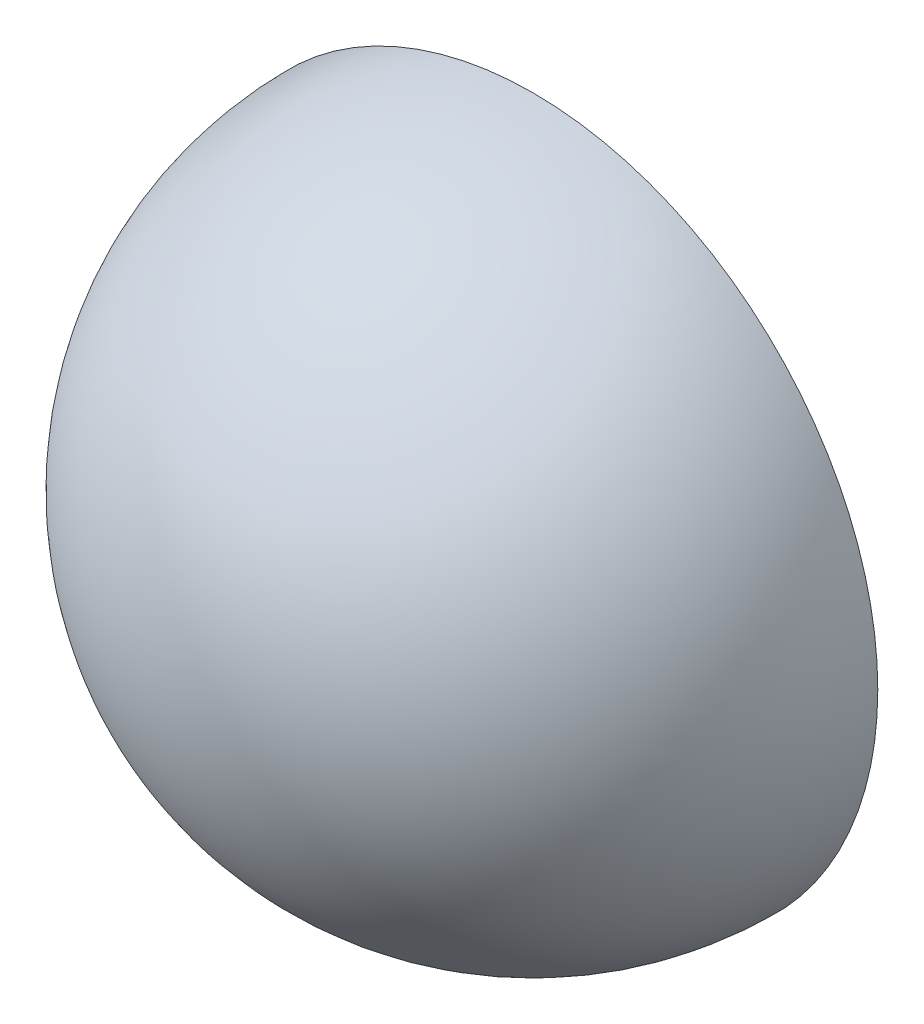
ISO-10303-21;
HEADER;
FILE_DESCRIPTION(('STEP AP214'),'2;1');
FILE_NAME('part.step','',(''),(''),'','','');
FILE_SCHEMA(('AUTOMOTIVE_DESIGN { 1 0 10303 214 1 1 1 1 }'));
ENDSEC;
DATA;
#1=APPLICATION_CONTEXT('core data for automotive mechanical design processes');
#2=APPLICATION_PROTOCOL_DEFINITION('international standard','automotive_design',2000,#1);
#3=PRODUCT_CONTEXT('',#1,'mechanical');
#4=PRODUCT('Part','Part','',(#3));
#5=PRODUCT_RELATED_PRODUCT_CATEGORY('part','',(#4));
#6=PRODUCT_DEFINITION_FORMATION('','',#4);
#7=PRODUCT_DEFINITION_CONTEXT('part definition',#1,'design');
#8=PRODUCT_DEFINITION('design','',#6,#7);
#9=PRODUCT_DEFINITION_SHAPE('','',#8);
#10=(LENGTH_UNIT() NAMED_UNIT(*) SI_UNIT(.MILLI.,.METRE.));
#11=(NAMED_UNIT(*) PLANE_ANGLE_UNIT() SI_UNIT($,.RADIAN.));
#12=(NAMED_UNIT(*) SI_UNIT($,.STERADIAN.) SOLID_ANGLE_UNIT());
#13=UNCERTAINTY_MEASURE_WITH_UNIT(LENGTH_MEASURE(1.E-05),#10,'distance_accuracy_value','');
#14=(GEOMETRIC_REPRESENTATION_CONTEXT(3) GLOBAL_UNCERTAINTY_ASSIGNED_CONTEXT((#13)) GLOBAL_UNIT_ASSIGNED_CONTEXT((#10,
#11,#12)) REPRESENTATION_CONTEXT('',''));
#15=CARTESIAN_POINT('',(0.,0.,0.));
#16=DIRECTION('',(0.,0.,1.));
#17=DIRECTION('',(1.,0.,0.));
#18=AXIS2_PLACEMENT_3D('',#15,#16,#17);
#19=CARTESIAN_POINT('',(0.,0.,0.));
#20=DIRECTION('',(0.,0.,1.));
#21=DIRECTION('',(0.,-1.,0.));
#22=AXIS2_PLACEMENT_3D('',#19,#20,#21);
#23=PLANE('',#22);
#24=CARTESIAN_POINT('',(0.,0.,0.));
#25=DIRECTION('',(0.,0.,-1.));
#26=DIRECTION('',(0.,1.,0.));
#27=AXIS2_PLACEMENT_3D('',#24,#25,#26);
#28=CIRCLE('',#27,8.5);
#29=CARTESIAN_POINT('',(0.,8.5,0.));
#30=VERTEX_POINT('',#29);
#31=EDGE_CURVE('E407',#30,#30,#28,.T.);
#32=ORIENTED_EDGE('',*,*,#31,.T.);
#33=EDGE_LOOP('',(#32));
#34=FACE_BOUND('',#33,.T.);
#35=CARTESIAN_POINT('',(0.,0.,0.));
#36=DIRECTION('',(0.,0.,-1.));
#37=DIRECTION('',(0.,1.,0.));
#38=AXIS2_PLACEMENT_3D('',#35,#36,#37);
#39=CIRCLE('',#38,3.);
#40=CARTESIAN_POINT('',(-2.14057647468727,2.1018878076661,0.));
#41=VERTEX_POINT('',#40);
#42=CARTESIAN_POINT('',(-0.75,2.90473750965556,0.));
#43=VERTEX_POINT('',#42);
#44=EDGE_CURVE('E437',#41,#43,#39,.T.);
#45=ORIENTED_EDGE('',*,*,#44,.F.);
#46=CARTESIAN_POINT('',(0.,0.,0.));
#47=DIRECTION('',(0.,0.,1.));
#48=DIRECTION('',(0.,-1.,0.));
#49=AXIS2_PLACEMENT_3D('',#46,#47,#48);
#50=CIRCLE('',#49,3.);
#51=CARTESIAN_POINT('',(-2.89057647468726,0.802849701989445,0.));
#52=VERTEX_POINT('',#51);
#53=EDGE_CURVE('E237',#41,#52,#50,.T.);
#54=ORIENTED_EDGE('',*,*,#53,.T.);
#55=CARTESIAN_POINT('',(0.,0.,0.));
#56=DIRECTION('',(0.,0.,-1.));
#57=DIRECTION('',(0.,1.,0.));
#58=AXIS2_PLACEMENT_3D('',#55,#56,#57);
#59=CIRCLE('',#58,3.);
#60=CARTESIAN_POINT('',(-2.89057647468726,-0.802849701989465,0.));
#61=VERTEX_POINT('',#60);
#62=EDGE_CURVE('E533',#61,#52,#59,.T.);
#63=ORIENTED_EDGE('',*,*,#62,.F.);
#64=CARTESIAN_POINT('',(0.,0.,0.));
#65=DIRECTION('',(0.,0.,1.));
#66=DIRECTION('',(0.,-1.,0.));
#67=AXIS2_PLACEMENT_3D('',#64,#65,#66);
#68=CIRCLE('',#67,3.00000000000001);
#69=CARTESIAN_POINT('',(-2.14057647468726,-2.10188780766612,0.));
#70=VERTEX_POINT('',#69);
#71=EDGE_CURVE('E277',#61,#70,#68,.T.);
#72=ORIENTED_EDGE('',*,*,#71,.T.);
#73=CARTESIAN_POINT('',(0.,0.,0.));
#74=DIRECTION('',(0.,0.,-1.));
#75=DIRECTION('',(0.,1.,0.));
#76=AXIS2_PLACEMENT_3D('',#73,#74,#75);
#77=CIRCLE('',#76,3.);
#78=CARTESIAN_POINT('',(-0.75,-2.90473750965556,0.));
#79=VERTEX_POINT('',#78);
#80=EDGE_CURVE('E514',#79,#70,#77,.T.);
#81=ORIENTED_EDGE('',*,*,#80,.F.);
#82=CARTESIAN_POINT('',(0.,0.,0.));
#83=DIRECTION('',(0.,0.,1.));
#84=DIRECTION('',(0.,-1.,0.));
#85=AXIS2_PLACEMENT_3D('',#82,#83,#84);
#86=CIRCLE('',#85,3.00000000000001);
#87=CARTESIAN_POINT('',(0.75,-2.90473750965556,0.));
#88=VERTEX_POINT('',#87);
#89=EDGE_CURVE('E239',#79,#88,#86,.T.);
#90=ORIENTED_EDGE('',*,*,#89,.T.);
#91=CARTESIAN_POINT('',(0.,0.,0.));
#92=DIRECTION('',(0.,0.,-1.));
#93=DIRECTION('',(0.,1.,0.));
#94=AXIS2_PLACEMENT_3D('',#91,#92,#93);
#95=CIRCLE('',#94,3.);
#96=CARTESIAN_POINT('',(2.14057647468727,-2.1018878076661,0.));
#97=VERTEX_POINT('',#96);
#98=EDGE_CURVE('E508',#97,#88,#95,.T.);
#99=ORIENTED_EDGE('',*,*,#98,.F.);
#100=CARTESIAN_POINT('',(0.,0.,0.));
#101=DIRECTION('',(0.,0.,1.));
#102=DIRECTION('',(0.,-1.,0.));
#103=AXIS2_PLACEMENT_3D('',#100,#101,#102);
#104=CIRCLE('',#103,3.00000000000001);
#105=CARTESIAN_POINT('',(2.89057647468727,-0.802849701989445,0.));
#106=VERTEX_POINT('',#105);
#107=EDGE_CURVE('E230',#97,#106,#104,.T.);
#108=ORIENTED_EDGE('',*,*,#107,.T.);
#109=CARTESIAN_POINT('',(0.,0.,0.));
#110=DIRECTION('',(0.,0.,-1.));
#111=DIRECTION('',(0.,1.,0.));
#112=AXIS2_PLACEMENT_3D('',#109,#110,#111);
#113=CIRCLE('',#112,3.);
#114=CARTESIAN_POINT('',(2.89057647468726,0.802849701989465,0.));
#115=VERTEX_POINT('',#114);
#116=EDGE_CURVE('E216',#115,#106,#113,.T.);
#117=ORIENTED_EDGE('',*,*,#116,.F.);
#118=CARTESIAN_POINT('',(0.,0.,0.));
#119=DIRECTION('',(0.,0.,1.));
#120=DIRECTION('',(0.,-1.,0.));
#121=AXIS2_PLACEMENT_3D('',#118,#119,#120);
#122=CIRCLE('',#121,3.);
#123=CARTESIAN_POINT('',(2.14057647468725,2.10188780766612,0.));
#124=VERTEX_POINT('',#123);
#125=EDGE_CURVE('E226',#115,#124,#122,.T.);
#126=ORIENTED_EDGE('',*,*,#125,.T.);
#127=CARTESIAN_POINT('',(0.,0.,0.));
#128=DIRECTION('',(0.,0.,-1.));
#129=DIRECTION('',(0.,1.,0.));
#130=AXIS2_PLACEMENT_3D('',#127,#128,#129);
#131=CIRCLE('',#130,3.);
#132=CARTESIAN_POINT('',(0.75,2.90473750965556,0.));
#133=VERTEX_POINT('',#132);
#134=EDGE_CURVE('E402',#133,#124,#131,.T.);
#135=ORIENTED_EDGE('',*,*,#134,.F.);
#136=CARTESIAN_POINT('',(0.,0.,0.));
#137=DIRECTION('',(0.,0.,1.));
#138=DIRECTION('',(0.,-1.,0.));
#139=AXIS2_PLACEMENT_3D('',#136,#137,#138);
#140=CIRCLE('',#139,3.);
#141=EDGE_CURVE('E235',#133,#43,#140,.T.);
#142=ORIENTED_EDGE('',*,*,#141,.T.);
#143=EDGE_LOOP('',(#45,#54,#63,#72,#81,#90,#99,#108,#117,#126,#135,#142));
#144=FACE_BOUND('',#143,.T.);
#145=ADVANCED_FACE('F33',(#34,#144),#23,.F.);
#146=CARTESIAN_POINT('',(0.,0.,5.));
#147=DIRECTION('',(0.,0.,-1.));
#148=DIRECTION('',(0.,1.,0.));
#149=AXIS2_PLACEMENT_3D('',#146,#147,#148);
#150=CYLINDRICAL_SURFACE('',#149,2.5);
#151=DIRECTION('',(0.,0.,-1.));
#152=VECTOR('',#151,1.);
#153=CARTESIAN_POINT('',(1.69033895523228,1.84194305460952,6.75020998329638));
#154=LINE('',#153,#152);
#155=CARTESIAN_POINT('',(1.69033895523228,1.84194305460952,5.));
#156=VERTEX_POINT('',#155);
#157=CARTESIAN_POINT('',(1.69033895523228,1.84194305460952,0.999999999999998));
#158=VERTEX_POINT('',#157);
#159=EDGE_CURVE('E387',#156,#158,#154,.T.);
#160=ORIENTED_EDGE('',*,*,#159,.T.);
#161=CARTESIAN_POINT('',(0.,0.,0.999999999999998));
#162=DIRECTION('',(0.,0.,1.));
#163=DIRECTION('',(0.,-1.,0.));
#164=AXIS2_PLACEMENT_3D('',#161,#162,#163);
#165=CIRCLE('',#164,2.5);
#166=CARTESIAN_POINT('',(2.44033895523229,0.542904948932864,0.999999999999998));
#167=VERTEX_POINT('',#166);
#168=EDGE_CURVE('E209',#158,#167,#165,.F.);
#169=ORIENTED_EDGE('',*,*,#168,.T.);
#170=DIRECTION('',(0.,0.,-1.));
#171=VECTOR('',#170,1.);
#172=CARTESIAN_POINT('',(2.44033895523229,0.542904948932865,6.75020998329638));
#173=LINE('',#172,#171);
#174=CARTESIAN_POINT('',(2.44033895523229,0.542904948932865,5.));
#175=VERTEX_POINT('',#174);
#176=EDGE_CURVE('E203',#175,#167,#173,.T.);
#177=ORIENTED_EDGE('',*,*,#176,.F.);
#178=CARTESIAN_POINT('',(0.,0.,5.));
#179=DIRECTION('',(0.,0.,-1.));
#180=DIRECTION('',(0.,1.,0.));
#181=AXIS2_PLACEMENT_3D('',#178,#179,#180);
#182=CIRCLE('',#181,2.5);
#183=EDGE_CURVE('E388',#156,#175,#182,.T.);
#184=ORIENTED_EDGE('',*,*,#183,.F.);
#185=EDGE_LOOP('',(#160,#169,#177,#184));
#186=FACE_BOUND('',#185,.T.);
#187=ADVANCED_FACE('F384',(#186),#150,.F.);
#188=DIRECTION('',(0.,0.,-1.));
#189=VECTOR('',#188,1.);
#190=CARTESIAN_POINT('',(2.44033895523229,-0.542904948932846,6.75020998329638));
#191=LINE('',#190,#189);
#192=CARTESIAN_POINT('',(2.44033895523229,-0.542904948932846,5.));
#193=VERTEX_POINT('',#192);
#194=CARTESIAN_POINT('',(2.44033895523229,-0.542904948932847,1.00000000000003));
#195=VERTEX_POINT('',#194);
#196=EDGE_CURVE('E821',#193,#195,#191,.T.);
#197=ORIENTED_EDGE('',*,*,#196,.T.);
#198=CARTESIAN_POINT('',(0.,0.,1.00000000000003));
#199=DIRECTION('',(0.,0.,1.));
#200=DIRECTION('',(0.,-1.,0.));
#201=AXIS2_PLACEMENT_3D('',#198,#199,#200);
#202=CIRCLE('',#201,2.5);
#203=CARTESIAN_POINT('',(1.69033895523229,-1.84194305460951,1.00000000000003));
#204=VERTEX_POINT('',#203);
#205=EDGE_CURVE('E302',#195,#204,#202,.F.);
#206=ORIENTED_EDGE('',*,*,#205,.T.);
#207=DIRECTION('',(0.,0.,-1.));
#208=VECTOR('',#207,1.);
#209=CARTESIAN_POINT('',(1.69033895523229,-1.84194305460951,6.75020998329638));
#210=LINE('',#209,#208);
#211=CARTESIAN_POINT('',(1.69033895523229,-1.84194305460951,5.));
#212=VERTEX_POINT('',#211);
#213=EDGE_CURVE('E492',#212,#204,#210,.T.);
#214=ORIENTED_EDGE('',*,*,#213,.F.);
#215=EDGE_CURVE('E408',#193,#212,#182,.T.);
#216=ORIENTED_EDGE('',*,*,#215,.F.);
#217=EDGE_LOOP('',(#197,#206,#214,#216));
#218=FACE_BOUND('',#217,.T.);
#219=ADVANCED_FACE('F499',(#218),#150,.F.);
#220=DIRECTION('',(0.,0.,-1.));
#221=VECTOR('',#220,1.);
#222=CARTESIAN_POINT('',(0.75,-2.38484800354236,6.75020998329638));
#223=LINE('',#222,#221);
#224=CARTESIAN_POINT('',(0.75,-2.38484800354236,5.));
#225=VERTEX_POINT('',#224);
#226=CARTESIAN_POINT('',(0.75,-2.38484800354236,1.00000000000001));
#227=VERTEX_POINT('',#226);
#228=EDGE_CURVE('E501',#225,#227,#223,.T.);
#229=ORIENTED_EDGE('',*,*,#228,.T.);
#230=CARTESIAN_POINT('',(0.,0.,1.00000000000001));
#231=DIRECTION('',(0.,0.,1.));
#232=DIRECTION('',(0.,-1.,0.));
#233=AXIS2_PLACEMENT_3D('',#230,#231,#232);
#234=CIRCLE('',#233,2.5);
#235=CARTESIAN_POINT('',(-0.75,-2.38484800354236,1.00000000000001));
#236=VERTEX_POINT('',#235);
#237=EDGE_CURVE('E332',#227,#236,#234,.F.);
#238=ORIENTED_EDGE('',*,*,#237,.T.);
#239=DIRECTION('',(0.,0.,-1.));
#240=VECTOR('',#239,1.);
#241=CARTESIAN_POINT('',(-0.75,-2.38484800354236,6.75020998329638));
#242=LINE('',#241,#240);
#243=CARTESIAN_POINT('',(-0.75,-2.38484800354236,5.));
#244=VERTEX_POINT('',#243);
#245=EDGE_CURVE('E518',#244,#236,#242,.T.);
#246=ORIENTED_EDGE('',*,*,#245,.F.);
#247=EDGE_CURVE('E469',#225,#244,#182,.T.);
#248=ORIENTED_EDGE('',*,*,#247,.F.);
#249=EDGE_LOOP('',(#229,#238,#246,#248));
#250=FACE_BOUND('',#249,.T.);
#251=ADVANCED_FACE('F578',(#250),#150,.F.);
#252=DIRECTION('',(0.,0.,-1.));
#253=VECTOR('',#252,1.);
#254=CARTESIAN_POINT('',(-1.69033895523228,-1.84194305460952,6.75020998329638));
#255=LINE('',#254,#253);
#256=CARTESIAN_POINT('',(-1.69033895523228,-1.84194305460952,5.));
#257=VERTEX_POINT('',#256);
#258=CARTESIAN_POINT('',(-1.69033895523228,-1.84194305460952,1.00000000000003));
#259=VERTEX_POINT('',#258);
#260=EDGE_CURVE('E526',#257,#259,#255,.T.);
#261=ORIENTED_EDGE('',*,*,#260,.T.);
#262=CARTESIAN_POINT('',(0.,0.,1.00000000000003));
#263=DIRECTION('',(0.,0.,1.));
#264=DIRECTION('',(0.,-1.,0.));
#265=AXIS2_PLACEMENT_3D('',#262,#263,#264);
#266=CIRCLE('',#265,2.5);
#267=CARTESIAN_POINT('',(-2.44033895523229,-0.542904948932863,1.00000000000003));
#268=VERTEX_POINT('',#267);
#269=EDGE_CURVE('E356',#259,#268,#266,.F.);
#270=ORIENTED_EDGE('',*,*,#269,.T.);
#271=DIRECTION('',(0.,0.,-1.));
#272=VECTOR('',#271,1.);
#273=CARTESIAN_POINT('',(-2.44033895523229,-0.542904948932863,6.75020998329638));
#274=LINE('',#273,#272);
#275=CARTESIAN_POINT('',(-2.44033895523229,-0.542904948932863,5.));
#276=VERTEX_POINT('',#275);
#277=EDGE_CURVE('E537',#276,#268,#274,.T.);
#278=ORIENTED_EDGE('',*,*,#277,.F.);
#279=EDGE_CURVE('E467',#257,#276,#182,.T.);
#280=ORIENTED_EDGE('',*,*,#279,.F.);
#281=EDGE_LOOP('',(#261,#270,#278,#280));
#282=FACE_BOUND('',#281,.T.);
#283=ADVANCED_FACE('F580',(#282),#150,.F.);
#284=DIRECTION('',(0.,0.,-1.));
#285=VECTOR('',#284,1.);
#286=CARTESIAN_POINT('',(-2.44033895523229,0.542904948932848,6.75020998329638));
#287=LINE('',#286,#285);
#288=CARTESIAN_POINT('',(-2.44033895523229,0.542904948932848,5.));
#289=VERTEX_POINT('',#288);
#290=CARTESIAN_POINT('',(-2.44033895523229,0.542904948932847,1.00000000000001));
#291=VERTEX_POINT('',#290);
#292=EDGE_CURVE('E421',#289,#291,#287,.T.);
#293=ORIENTED_EDGE('',*,*,#292,.T.);
#294=CARTESIAN_POINT('',(0.,0.,1.00000000000001));
#295=DIRECTION('',(0.,0.,1.));
#296=DIRECTION('',(0.,-1.,0.));
#297=AXIS2_PLACEMENT_3D('',#294,#295,#296);
#298=CIRCLE('',#297,2.5);
#299=CARTESIAN_POINT('',(-1.69033895523229,1.84194305460951,1.00000000000001));
#300=VERTEX_POINT('',#299);
#301=EDGE_CURVE('E278',#291,#300,#298,.F.);
#302=ORIENTED_EDGE('',*,*,#301,.T.);
#303=DIRECTION('',(0.,0.,-1.));
#304=VECTOR('',#303,1.);
#305=CARTESIAN_POINT('',(-1.69033895523229,1.84194305460951,6.75020998329638));
#306=LINE('',#305,#304);
#307=CARTESIAN_POINT('',(-1.69033895523229,1.84194305460951,5.));
#308=VERTEX_POINT('',#307);
#309=EDGE_CURVE('E420',#308,#300,#306,.T.);
#310=ORIENTED_EDGE('',*,*,#309,.F.);
#311=EDGE_CURVE('E466',#289,#308,#182,.T.);
#312=ORIENTED_EDGE('',*,*,#311,.F.);
#313=EDGE_LOOP('',(#293,#302,#310,#312));
#314=FACE_BOUND('',#313,.T.);
#315=ADVANCED_FACE('F418',(#314),#150,.F.);
#316=DIRECTION('',(0.,0.,-1.));
#317=VECTOR('',#316,1.);
#318=CARTESIAN_POINT('',(-0.75,2.38484800354236,6.75020998329638));
#319=LINE('',#318,#317);
#320=CARTESIAN_POINT('',(-0.75,2.38484800354236,5.));
#321=VERTEX_POINT('',#320);
#322=CARTESIAN_POINT('',(-0.75,2.38484800354236,0.999999999999999));
#323=VERTEX_POINT('',#322);
#324=EDGE_CURVE('E429',#321,#323,#319,.T.);
#325=ORIENTED_EDGE('',*,*,#324,.T.);
#326=CARTESIAN_POINT('',(0.,0.,0.999999999999999));
#327=DIRECTION('',(0.,0.,1.));
#328=DIRECTION('',(0.,-1.,0.));
#329=AXIS2_PLACEMENT_3D('',#326,#327,#328);
#330=CIRCLE('',#329,2.5);
#331=CARTESIAN_POINT('',(0.75,2.38484800354236,0.999999999999999));
#332=VERTEX_POINT('',#331);
#333=EDGE_CURVE('E251',#323,#332,#330,.F.);
#334=ORIENTED_EDGE('',*,*,#333,.T.);
#335=DIRECTION('',(0.,0.,-1.));
#336=VECTOR('',#335,1.);
#337=CARTESIAN_POINT('',(0.75,2.38484800354237,6.75020998329638));
#338=LINE('',#337,#336);
#339=CARTESIAN_POINT('',(0.75,2.38484800354236,5.));
#340=VERTEX_POINT('',#339);
#341=EDGE_CURVE('E390',#340,#332,#338,.T.);
#342=ORIENTED_EDGE('',*,*,#341,.F.);
#343=EDGE_CURVE('E405',#321,#340,#182,.T.);
#344=ORIENTED_EDGE('',*,*,#343,.F.);
#345=EDGE_LOOP('',(#325,#334,#342,#344));
#346=FACE_BOUND('',#345,.T.);
#347=ADVANCED_FACE('F462',(#346),#150,.F.);
#348=CARTESIAN_POINT('',(0.,0.,0.));
#349=DIRECTION('',(0.,0.,-1.));
#350=DIRECTION('',(0.,-1.,0.));
#351=AXIS2_PLACEMENT_3D('',#348,#349,#350);
#352=SPHERICAL_SURFACE('',#351,8.5);
#353=ORIENTED_EDGE('',*,*,#31,.F.);
#354=EDGE_LOOP('',(#353));
#355=FACE_BOUND('',#354,.T.);
#356=ADVANCED_FACE('F264',(#355),#352,.T.);
#357=CARTESIAN_POINT('',(0.,0.,5.));
#358=DIRECTION('',(0.,0.,-1.));
#359=DIRECTION('',(0.,1.,0.));
#360=AXIS2_PLACEMENT_3D('',#357,#358,#359);
#361=PLANE('',#360);
#362=ORIENTED_EDGE('',*,*,#183,.T.);
#363=DIRECTION('',(0.866025403784436,0.500000000000004,0.));
#364=VECTOR('',#363,1.);
#365=CARTESIAN_POINT('',(0.375000000000003,-0.649519052838327,5.));
#366=LINE('',#365,#364);
#367=CARTESIAN_POINT('',(2.89057647468726,0.802849701989466,5.));
#368=VERTEX_POINT('',#367);
#369=EDGE_CURVE('E815',#175,#368,#366,.T.);
#370=ORIENTED_EDGE('',*,*,#369,.T.);
#371=CARTESIAN_POINT('',(0.,0.,5.));
#372=DIRECTION('',(0.,0.,-1.));
#373=DIRECTION('',(0.,1.,0.));
#374=AXIS2_PLACEMENT_3D('',#371,#372,#373);
#375=CIRCLE('',#374,3.);
#376=CARTESIAN_POINT('',(2.89057647468727,-0.802849701989445,5.));
#377=VERTEX_POINT('',#376);
#378=EDGE_CURVE('E219',#377,#368,#375,.F.);
#379=ORIENTED_EDGE('',*,*,#378,.F.);
#380=DIRECTION('',(0.86602540378444,-0.499999999999998,0.));
#381=VECTOR('',#380,1.);
#382=CARTESIAN_POINT('',(0.374999999999998,0.64951905283833,5.));
#383=LINE('',#382,#381);
#384=EDGE_CURVE('E486',#193,#377,#383,.T.);
#385=ORIENTED_EDGE('',*,*,#384,.F.);
#386=ORIENTED_EDGE('',*,*,#215,.T.);
#387=DIRECTION('',(0.86602540378444,-0.499999999999998,0.));
#388=VECTOR('',#387,1.);
#389=CARTESIAN_POINT('',(-0.374999999999998,-0.649519052838329,5.));
#390=LINE('',#389,#388);
#391=CARTESIAN_POINT('',(2.14057647468727,-2.10188780766611,5.));
#392=VERTEX_POINT('',#391);
#393=EDGE_CURVE('E484',#212,#392,#390,.T.);
#394=ORIENTED_EDGE('',*,*,#393,.T.);
#395=CARTESIAN_POINT('',(0.,0.,5.));
#396=DIRECTION('',(0.,0.,-1.));
#397=DIRECTION('',(0.,1.,0.));
#398=AXIS2_PLACEMENT_3D('',#395,#396,#397);
#399=CIRCLE('',#398,3.);
#400=CARTESIAN_POINT('',(0.75,-2.90473750965556,5.));
#401=VERTEX_POINT('',#400);
#402=EDGE_CURVE('E495',#401,#392,#399,.F.);
#403=ORIENTED_EDGE('',*,*,#402,.F.);
#404=DIRECTION('',(0.,-1.,0.));
#405=VECTOR('',#404,1.);
#406=CARTESIAN_POINT('',(0.75,0.,5.));
#407=LINE('',#406,#405);
#408=EDGE_CURVE('E496',#225,#401,#407,.T.);
#409=ORIENTED_EDGE('',*,*,#408,.F.);
#410=ORIENTED_EDGE('',*,*,#247,.T.);
#411=DIRECTION('',(0.,-1.,0.));
#412=VECTOR('',#411,1.);
#413=CARTESIAN_POINT('',(-0.75,0.,5.));
#414=LINE('',#413,#412);
#415=CARTESIAN_POINT('',(-0.75,-2.90473750965556,5.));
#416=VERTEX_POINT('',#415);
#417=EDGE_CURVE('E517',#244,#416,#414,.T.);
#418=ORIENTED_EDGE('',*,*,#417,.T.);
#419=CARTESIAN_POINT('',(0.,0.,5.));
#420=DIRECTION('',(0.,0.,-1.));
#421=DIRECTION('',(0.,1.,0.));
#422=AXIS2_PLACEMENT_3D('',#419,#420,#421);
#423=CIRCLE('',#422,3.);
#424=CARTESIAN_POINT('',(-2.14057647468726,-2.10188780766612,5.));
#425=VERTEX_POINT('',#424);
#426=EDGE_CURVE('E520',#425,#416,#423,.F.);
#427=ORIENTED_EDGE('',*,*,#426,.F.);
#428=DIRECTION('',(0.866025403784436,0.500000000000004,0.));
#429=VECTOR('',#428,1.);
#430=CARTESIAN_POINT('',(0.375000000000003,-0.649519052838327,5.));
#431=LINE('',#430,#429);
#432=EDGE_CURVE('E515',#425,#257,#431,.T.);
#433=ORIENTED_EDGE('',*,*,#432,.T.);
#434=ORIENTED_EDGE('',*,*,#279,.T.);
#435=DIRECTION('',(0.866025403784436,0.500000000000004,0.));
#436=VECTOR('',#435,1.);
#437=CARTESIAN_POINT('',(-0.375000000000003,0.649519052838328,5.));
#438=LINE('',#437,#436);
#439=CARTESIAN_POINT('',(-2.89057647468726,-0.802849701989464,5.));
#440=VERTEX_POINT('',#439);
#441=EDGE_CURVE('E536',#440,#276,#438,.T.);
#442=ORIENTED_EDGE('',*,*,#441,.F.);
#443=CARTESIAN_POINT('',(0.,0.,5.));
#444=DIRECTION('',(0.,0.,-1.));
#445=DIRECTION('',(0.,1.,0.));
#446=AXIS2_PLACEMENT_3D('',#443,#444,#445);
#447=CIRCLE('',#446,3.);
#448=CARTESIAN_POINT('',(-2.89057647468726,0.802849701989446,5.));
#449=VERTEX_POINT('',#448);
#450=EDGE_CURVE('E539',#449,#440,#447,.F.);
#451=ORIENTED_EDGE('',*,*,#450,.F.);
#452=DIRECTION('',(0.86602540378444,-0.499999999999998,0.));
#453=VECTOR('',#452,1.);
#454=CARTESIAN_POINT('',(-0.374999999999998,-0.649519052838329,5.));
#455=LINE('',#454,#453);
#456=EDGE_CURVE('E534',#449,#289,#455,.T.);
#457=ORIENTED_EDGE('',*,*,#456,.T.);
#458=ORIENTED_EDGE('',*,*,#311,.T.);
#459=DIRECTION('',(0.86602540378444,-0.499999999999998,0.));
#460=VECTOR('',#459,1.);
#461=CARTESIAN_POINT('',(0.374999999999998,0.64951905283833,5.));
#462=LINE('',#461,#460);
#463=CARTESIAN_POINT('',(-2.14057647468727,2.1018878076661,5.));
#464=VERTEX_POINT('',#463);
#465=EDGE_CURVE('E427',#464,#308,#462,.T.);
#466=ORIENTED_EDGE('',*,*,#465,.F.);
#467=CARTESIAN_POINT('',(0.,0.,5.));
#468=DIRECTION('',(0.,0.,-1.));
#469=DIRECTION('',(0.,1.,0.));
#470=AXIS2_PLACEMENT_3D('',#467,#468,#469);
#471=CIRCLE('',#470,3.);
#472=CARTESIAN_POINT('',(-0.75,2.90473750965556,5.));
#473=VERTEX_POINT('',#472);
#474=EDGE_CURVE('E444',#473,#464,#471,.F.);
#475=ORIENTED_EDGE('',*,*,#474,.F.);
#476=DIRECTION('',(0.,-1.,0.));
#477=VECTOR('',#476,1.);
#478=CARTESIAN_POINT('',(-0.75,0.,5.));
#479=LINE('',#478,#477);
#480=EDGE_CURVE('E428',#473,#321,#479,.T.);
#481=ORIENTED_EDGE('',*,*,#480,.T.);
#482=ORIENTED_EDGE('',*,*,#343,.T.);
#483=DIRECTION('',(0.,-1.,0.));
#484=VECTOR('',#483,1.);
#485=CARTESIAN_POINT('',(0.75,0.,5.));
#486=LINE('',#485,#484);
#487=CARTESIAN_POINT('',(0.75,2.90473750965557,5.));
#488=VERTEX_POINT('',#487);
#489=EDGE_CURVE('E406',#488,#340,#486,.T.);
#490=ORIENTED_EDGE('',*,*,#489,.F.);
#491=CARTESIAN_POINT('',(0.,0.,5.));
#492=DIRECTION('',(0.,0.,-1.));
#493=DIRECTION('',(0.,1.,0.));
#494=AXIS2_PLACEMENT_3D('',#491,#492,#493);
#495=CIRCLE('',#494,3.);
#496=CARTESIAN_POINT('',(2.14057647468725,2.10188780766612,5.));
#497=VERTEX_POINT('',#496);
#498=EDGE_CURVE('E403',#497,#488,#495,.F.);
#499=ORIENTED_EDGE('',*,*,#498,.F.);
#500=DIRECTION('',(0.866025403784436,0.500000000000004,0.));
#501=VECTOR('',#500,1.);
#502=CARTESIAN_POINT('',(-0.375000000000003,0.649519052838328,5.));
#503=LINE('',#502,#501);
#504=EDGE_CURVE('E394',#156,#497,#503,.T.);
#505=ORIENTED_EDGE('',*,*,#504,.F.);
#506=EDGE_LOOP('',(#362,#370,#379,#385,#386,#394,#403,#409,#410,#418,#427,#433,#434,#442,#451,
#457,#458,#466,#475,#481,#482,#490,#499,#505));
#507=FACE_BOUND('',#506,.T.);
#508=ADVANCED_FACE('F482',(#507),#361,.T.);
#509=CARTESIAN_POINT('',(0.75,0.,6.75020998329638));
#510=DIRECTION('',(-1.,0.,0.));
#511=DIRECTION('',(0.,0.,1.));
#512=AXIS2_PLACEMENT_3D('',#509,#510,#511);
#513=PLANE('',#512);
#514=ORIENTED_EDGE('',*,*,#341,.T.);
#515=CARTESIAN_POINT('',(0.75,2.38484800354236,0.999999999999999));
#516=CARTESIAN_POINT('',(0.75,2.42844975249854,0.916811242252568));
#517=CARTESIAN_POINT('',(0.75,2.47196866138024,0.833579117080067));
#518=CARTESIAN_POINT('',(0.75,2.55886153632701,0.667039476780042));
#519=CARTESIAN_POINT('',(0.75,2.60223550272351,0.583731961825455));
#520=CARTESIAN_POINT('',(0.75,2.68885940428663,0.417052554334177));
#521=CARTESIAN_POINT('',(0.75,2.73210933952508,0.333680661834801));
#522=CARTESIAN_POINT('',(0.75,2.8185008413869,0.166880503115612));
#523=CARTESIAN_POINT('',(0.75,2.86164240776248,0.0834522367674578));
#524=CARTESIAN_POINT('',(0.75,2.90473750965556,0.));
#525=B_SPLINE_CURVE_WITH_KNOTS('',3,(#515,#516,#517,#518,#519,#520,#521,#522,#523,#524),
.UNSPECIFIED.,.F.,.F.,(4,2,2,2,4),(0.,0.2817681212118,0.563535597705419,0.845302910997307,
1.12707086793509),.UNSPECIFIED.);
#526=EDGE_CURVE('E378',#332,#133,#525,.T.);
#527=ORIENTED_EDGE('',*,*,#526,.T.);
#528=DIRECTION('',(0.,0.,-1.));
#529=VECTOR('',#528,1.);
#530=CARTESIAN_POINT('',(0.75,2.90473750965556,6.75020998329638));
#531=LINE('',#530,#529);
#532=EDGE_CURVE('E396',#488,#133,#531,.T.);
#533=ORIENTED_EDGE('',*,*,#532,.F.);
#534=ORIENTED_EDGE('',*,*,#489,.T.);
#535=EDGE_LOOP('',(#514,#527,#533,#534));
#536=FACE_BOUND('',#535,.T.);
#537=ADVANCED_FACE('F294',(#536),#513,.F.);
#538=CARTESIAN_POINT('',(-0.375000000000003,0.649519052838328,6.75020998329638));
#539=DIRECTION('',(0.500000000000004,-0.866025403784436,0.));
#540=DIRECTION('',(0.866025403784436,0.500000000000004,0.));
#541=AXIS2_PLACEMENT_3D('',#538,#539,#540);
#542=PLANE('',#541);
#543=DIRECTION('',(0.,0.,-1.));
#544=VECTOR('',#543,1.);
#545=CARTESIAN_POINT('',(2.14057647468725,2.10188780766612,6.75020998329638));
#546=LINE('',#545,#544);
#547=EDGE_CURVE('E391',#497,#124,#546,.T.);
#548=ORIENTED_EDGE('',*,*,#547,.T.);
#549=CARTESIAN_POINT('',(2.14057647468725,2.10188780766612,0.));
#550=CARTESIAN_POINT('',(2.10325502166917,2.08034025671958,0.0834522367674576));
#551=CARTESIAN_POINT('',(2.06589332922886,2.05876947353179,0.166880503115611));
#552=CARTESIAN_POINT('',(1.99107609394544,2.01557372260088,0.3336806618348));
#553=CARTESIAN_POINT('',(1.9536205513169,1.99394875498165,0.417052554334176));
#554=CARTESIAN_POINT('',(1.87860205198832,1.95063680420009,0.583731961825454));
#555=CARTESIAN_POINT('',(1.84103909522606,1.92894982100184,0.667039476780041));
#556=CARTESIAN_POINT('',(1.76578765811429,1.88550338352846,0.833579117080066));
#557=CARTESIAN_POINT('',(1.72809917747776,1.86374392908761,0.916811242252567));
#558=CARTESIAN_POINT('',(1.69033895523228,1.84194305460952,0.999999999999998));
#559=B_SPLINE_CURVE_WITH_KNOTS('',3,(#549,#550,#551,#552,#553,#554,#555,#556,#557,#558),
.UNSPECIFIED.,.F.,.F.,(4,2,2,2,4),(0.,0.281767956937786,0.563535270229674,0.845302746723294,
1.12707086793509),.UNSPECIFIED.);
#560=EDGE_CURVE('E208',#124,#158,#559,.T.);
#561=ORIENTED_EDGE('',*,*,#560,.T.);
#562=ORIENTED_EDGE('',*,*,#159,.F.);
#563=ORIENTED_EDGE('',*,*,#504,.T.);
#564=EDGE_LOOP('',(#548,#561,#562,#563));
#565=FACE_BOUND('',#564,.T.);
#566=ADVANCED_FACE('F290',(#565),#542,.F.);
#567=CARTESIAN_POINT('',(0.,0.,6.75020998329638));
#568=DIRECTION('',(0.,0.,-1.));
#569=DIRECTION('',(0.,1.,0.));
#570=AXIS2_PLACEMENT_3D('',#567,#568,#569);
#571=CYLINDRICAL_SURFACE('',#570,3.);
#572=ORIENTED_EDGE('',*,*,#498,.T.);
#573=ORIENTED_EDGE('',*,*,#532,.T.);
#574=ORIENTED_EDGE('',*,*,#134,.T.);
#575=ORIENTED_EDGE('',*,*,#547,.F.);
#576=EDGE_LOOP('',(#572,#573,#574,#575));
#577=FACE_BOUND('',#576,.T.);
#578=ADVANCED_FACE('F286',(#577),#571,.F.);
#579=CARTESIAN_POINT('',(0.374999999999998,0.649519052838331,6.75020998329638));
#580=DIRECTION('',(-0.499999999999998,-0.86602540378444,0.));
#581=DIRECTION('',(0.86602540378444,-0.499999999999998,0.));
#582=AXIS2_PLACEMENT_3D('',#579,#580,#581);
#583=PLANE('',#582);
#584=ORIENTED_EDGE('',*,*,#309,.T.);
#585=CARTESIAN_POINT('',(-1.69033895523229,1.84194305460951,1.00000000000001));
#586=CARTESIAN_POINT('',(-1.72809917747778,1.8637439290876,0.916811242252575));
#587=CARTESIAN_POINT('',(-1.76578765811431,1.88550338352845,0.833579117080073));
#588=CARTESIAN_POINT('',(-1.84103909522608,1.92894982100183,0.667039476780047));
#589=CARTESIAN_POINT('',(-1.87860205198833,1.95063680420008,0.583731961825459));
#590=CARTESIAN_POINT('',(-1.95362055131692,1.99394875498164,0.41705255433418));
#591=CARTESIAN_POINT('',(-1.99107609394546,2.01557372260087,0.333680661834803));
#592=CARTESIAN_POINT('',(-2.06589332922888,2.05876947353177,0.166880503115613));
#593=CARTESIAN_POINT('',(-2.10325502166918,2.08034025671957,0.0834522367674583));
#594=CARTESIAN_POINT('',(-2.14057647468727,2.10188780766611,0.));
#595=B_SPLINE_CURVE_WITH_KNOTS('',3,(#585,#586,#587,#588,#589,#590,#591,#592,#593,#594),
.UNSPECIFIED.,.F.,.F.,(4,2,2,2,4),(0.,0.281768121211803,0.563535597705425,0.845302910997315,
1.1270708679351),.UNSPECIFIED.);
#596=EDGE_CURVE('E270',#300,#41,#595,.T.);
#597=ORIENTED_EDGE('',*,*,#596,.T.);
#598=DIRECTION('',(0.,0.,-1.));
#599=VECTOR('',#598,1.);
#600=CARTESIAN_POINT('',(-2.14057647468727,2.10188780766611,6.75020998329638));
#601=LINE('',#600,#599);
#602=EDGE_CURVE('E442',#464,#41,#601,.T.);
#603=ORIENTED_EDGE('',*,*,#602,.F.);
#604=ORIENTED_EDGE('',*,*,#465,.T.);
#605=EDGE_LOOP('',(#584,#597,#603,#604));
#606=FACE_BOUND('',#605,.T.);
#607=ADVANCED_FACE('F280',(#606),#583,.F.);
#608=CARTESIAN_POINT('',(-0.75,0.,6.75020998329638));
#609=DIRECTION('',(-1.,0.,0.));
#610=DIRECTION('',(0.,0.,1.));
#611=AXIS2_PLACEMENT_3D('',#608,#609,#610);
#612=PLANE('',#611);
#613=DIRECTION('',(0.,0.,-1.));
#614=VECTOR('',#613,1.);
#615=CARTESIAN_POINT('',(-0.75,2.90473750965556,6.75020998329638));
#616=LINE('',#615,#614);
#617=EDGE_CURVE('E434',#473,#43,#616,.T.);
#618=ORIENTED_EDGE('',*,*,#617,.T.);
#619=CARTESIAN_POINT('',(-0.75,2.90473750965556,0.));
#620=CARTESIAN_POINT('',(-0.75,2.86164240776248,0.0834522367674576));
#621=CARTESIAN_POINT('',(-0.75,2.8185008413869,0.166880503115612));
#622=CARTESIAN_POINT('',(-0.75,2.73210933952508,0.333680661834801));
#623=CARTESIAN_POINT('',(-0.75,2.68885940428663,0.417052554334177));
#624=CARTESIAN_POINT('',(-0.75,2.60223550272351,0.583731961825455));
#625=CARTESIAN_POINT('',(-0.75,2.55886153632701,0.667039476780042));
#626=CARTESIAN_POINT('',(-0.75,2.47196866138024,0.833579117080067));
#627=CARTESIAN_POINT('',(-0.75,2.42844975249854,0.916811242252568));
#628=CARTESIAN_POINT('',(-0.75,2.38484800354236,0.999999999999999));
#629=B_SPLINE_CURVE_WITH_KNOTS('',3,(#619,#620,#621,#622,#623,#624,#625,#626,#627,#628),
.UNSPECIFIED.,.F.,.F.,(4,2,2,2,4),(0.,0.281767956937786,0.563535270229674,0.845302746723294,
1.12707086793509),.UNSPECIFIED.);
#630=EDGE_CURVE('E374',#43,#323,#629,.T.);
#631=ORIENTED_EDGE('',*,*,#630,.T.);
#632=ORIENTED_EDGE('',*,*,#324,.F.);
#633=ORIENTED_EDGE('',*,*,#480,.F.);
#634=EDGE_LOOP('',(#618,#631,#632,#633));
#635=FACE_BOUND('',#634,.T.);
#636=ADVANCED_FACE('F285',(#635),#612,.T.);
#637=CARTESIAN_POINT('',(0.,0.,6.75020998329638));
#638=DIRECTION('',(0.,0.,-1.));
#639=DIRECTION('',(0.,1.,0.));
#640=AXIS2_PLACEMENT_3D('',#637,#638,#639);
#641=CYLINDRICAL_SURFACE('',#640,3.);
#642=ORIENTED_EDGE('',*,*,#474,.T.);
#643=ORIENTED_EDGE('',*,*,#602,.T.);
#644=ORIENTED_EDGE('',*,*,#44,.T.);
#645=ORIENTED_EDGE('',*,*,#617,.F.);
#646=EDGE_LOOP('',(#642,#643,#644,#645));
#647=FACE_BOUND('',#646,.T.);
#648=ADVANCED_FACE('F288',(#647),#641,.F.);
#649=CARTESIAN_POINT('',(-0.375000000000003,0.649519052838328,6.75020998329638));
#650=DIRECTION('',(0.500000000000004,-0.866025403784436,0.));
#651=DIRECTION('',(0.866025403784436,0.500000000000004,0.));
#652=AXIS2_PLACEMENT_3D('',#649,#650,#651);
#653=PLANE('',#652);
#654=ORIENTED_EDGE('',*,*,#277,.T.);
#655=CARTESIAN_POINT('',(-2.44033895523229,-0.542904948932863,1.00000000000003));
#656=CARTESIAN_POINT('',(-2.47809917747777,-0.564705823410953,0.916811242252596));
#657=CARTESIAN_POINT('',(-2.5157876581143,-0.586465277851803,0.833579117080092));
#658=CARTESIAN_POINT('',(-2.59103909522607,-0.629911715325192,0.667039476780062));
#659=CARTESIAN_POINT('',(-2.62860205198833,-0.651598698523439,0.583731961825473));
#660=CARTESIAN_POINT('',(-2.70362055131692,-0.694910649305002,0.417052554334189));
#661=CARTESIAN_POINT('',(-2.74107609394545,-0.716535616924231,0.333680661834811));
#662=CARTESIAN_POINT('',(-2.81589332922888,-0.759731367855138,0.166880503115617));
#663=CARTESIAN_POINT('',(-2.85325502166918,-0.78130215104293,0.0834522367674604));
#664=CARTESIAN_POINT('',(-2.89057647468727,-0.802849701989471,0.));
#665=B_SPLINE_CURVE_WITH_KNOTS('',3,(#655,#656,#657,#658,#659,#660,#661,#662,#663,#664),
.UNSPECIFIED.,.F.,.F.,(4,2,2,2,4),(0.,0.281768121211808,0.563535597705437,0.845302910997334,
1.12707086793513),.UNSPECIFIED.);
#666=EDGE_CURVE('E46',#268,#61,#665,.T.);
#667=ORIENTED_EDGE('',*,*,#666,.T.);
#668=DIRECTION('',(0.,0.,-1.));
#669=VECTOR('',#668,1.);
#670=CARTESIAN_POINT('',(-2.89057647468726,-0.802849701989465,6.75020998329638));
#671=LINE('',#670,#669);
#672=EDGE_CURVE('E542',#440,#61,#671,.T.);
#673=ORIENTED_EDGE('',*,*,#672,.F.);
#674=ORIENTED_EDGE('',*,*,#441,.T.);
#675=EDGE_LOOP('',(#654,#667,#673,#674));
#676=FACE_BOUND('',#675,.T.);
#677=ADVANCED_FACE('F365',(#676),#653,.F.);
#678=CARTESIAN_POINT('',(-0.374999999999998,-0.649519052838329,6.75020998329638));
#679=DIRECTION('',(-0.499999999999998,-0.86602540378444,0.));
#680=DIRECTION('',(0.86602540378444,-0.499999999999998,0.));
#681=AXIS2_PLACEMENT_3D('',#678,#679,#680);
#682=PLANE('',#681);
#683=DIRECTION('',(0.,0.,-1.));
#684=VECTOR('',#683,1.);
#685=CARTESIAN_POINT('',(-2.89057647468726,0.802849701989446,6.75020998329638));
#686=LINE('',#685,#684);
#687=EDGE_CURVE('E546',#449,#52,#686,.T.);
#688=ORIENTED_EDGE('',*,*,#687,.T.);
#689=CARTESIAN_POINT('',(-2.89057647468727,0.802849701989446,0.));
#690=CARTESIAN_POINT('',(-2.85325502166918,0.781302151042906,0.0834522367674582));
#691=CARTESIAN_POINT('',(-2.81589332922887,0.759731367855114,0.166880503115613));
#692=CARTESIAN_POINT('',(-2.74107609394545,0.716535616924208,0.333680661834803));
#693=CARTESIAN_POINT('',(-2.70362055131692,0.694910649304981,0.41705255433418));
#694=CARTESIAN_POINT('',(-2.62860205198833,0.651598698523419,0.58373196182546));
#695=CARTESIAN_POINT('',(-2.59103909522607,0.629911715325173,0.667039476780047));
#696=CARTESIAN_POINT('',(-2.5157876581143,0.586465277851786,0.833579117080073));
#697=CARTESIAN_POINT('',(-2.47809917747777,0.564705823410936,0.916811242252575));
#698=CARTESIAN_POINT('',(-2.44033895523229,0.542904948932847,1.00000000000001));
#699=B_SPLINE_CURVE_WITH_KNOTS('',3,(#689,#690,#691,#692,#693,#694,#695,#696,#697,#698),
.UNSPECIFIED.,.F.,.F.,(4,2,2,2,4),(0.,0.281767956937789,0.563535270229679,0.845302746723301,
1.1270708679351),.UNSPECIFIED.);
#700=EDGE_CURVE('E244',#52,#291,#699,.T.);
#701=ORIENTED_EDGE('',*,*,#700,.T.);
#702=ORIENTED_EDGE('',*,*,#292,.F.);
#703=ORIENTED_EDGE('',*,*,#456,.F.);
#704=EDGE_LOOP('',(#688,#701,#702,#703));
#705=FACE_BOUND('',#704,.T.);
#706=ADVANCED_FACE('F253',(#705),#682,.T.);
#707=CARTESIAN_POINT('',(0.,0.,6.75020998329638));
#708=DIRECTION('',(0.,0.,-1.));
#709=DIRECTION('',(0.,1.,0.));
#710=AXIS2_PLACEMENT_3D('',#707,#708,#709);
#711=CYLINDRICAL_SURFACE('',#710,3.);
#712=ORIENTED_EDGE('',*,*,#450,.T.);
#713=ORIENTED_EDGE('',*,*,#672,.T.);
#714=ORIENTED_EDGE('',*,*,#62,.T.);
#715=ORIENTED_EDGE('',*,*,#687,.F.);
#716=EDGE_LOOP('',(#712,#713,#714,#715));
#717=FACE_BOUND('',#716,.T.);
#718=ADVANCED_FACE('F369',(#717),#711,.F.);
#719=CARTESIAN_POINT('',(-0.75,0.,6.75020998329638));
#720=DIRECTION('',(-1.,0.,0.));
#721=DIRECTION('',(0.,0.,1.));
#722=AXIS2_PLACEMENT_3D('',#719,#720,#721);
#723=PLANE('',#722);
#724=ORIENTED_EDGE('',*,*,#245,.T.);
#725=CARTESIAN_POINT('',(-0.75,-2.38484800354236,1.00000000000001));
#726=CARTESIAN_POINT('',(-0.75,-2.42844975249854,0.916811242252582));
#727=CARTESIAN_POINT('',(-0.75,-2.47196866138024,0.83357911708008));
#728=CARTESIAN_POINT('',(-0.75,-2.55886153632702,0.667039476780052));
#729=CARTESIAN_POINT('',(-0.75,-2.60223550272351,0.583731961825464));
#730=CARTESIAN_POINT('',(-0.75,-2.68885940428664,0.417052554334183));
#731=CARTESIAN_POINT('',(-0.75,-2.73210933952509,0.333680661834806));
#732=CARTESIAN_POINT('',(-0.75,-2.8185008413869,0.166880503115614));
#733=CARTESIAN_POINT('',(-0.75,-2.86164240776249,0.083452236767459));
#734=CARTESIAN_POINT('',(-0.75,-2.90473750965557,0.));
#735=B_SPLINE_CURVE_WITH_KNOTS('',3,(#725,#726,#727,#728,#729,#730,#731,#732,#733,#734),
.UNSPECIFIED.,.F.,.F.,(4,2,2,2,4),(0.,0.281768121211804,0.563535597705428,0.845302910997321,
1.12707086793511),.UNSPECIFIED.);
#736=EDGE_CURVE('E357',#236,#79,#735,.T.);
#737=ORIENTED_EDGE('',*,*,#736,.T.);
#738=DIRECTION('',(0.,0.,-1.));
#739=VECTOR('',#738,1.);
#740=CARTESIAN_POINT('',(-0.75,-2.90473750965556,6.75020998329638));
#741=LINE('',#740,#739);
#742=EDGE_CURVE('E523',#416,#79,#741,.T.);
#743=ORIENTED_EDGE('',*,*,#742,.F.);
#744=ORIENTED_EDGE('',*,*,#417,.F.);
#745=EDGE_LOOP('',(#724,#737,#743,#744));
#746=FACE_BOUND('',#745,.T.);
#747=ADVANCED_FACE('F573',(#746),#723,.T.);
#748=CARTESIAN_POINT('',(0.375000000000003,-0.649519052838326,6.75020998329638));
#749=DIRECTION('',(0.500000000000004,-0.866025403784436,0.));
#750=DIRECTION('',(0.866025403784436,0.500000000000004,0.));
#751=AXIS2_PLACEMENT_3D('',#748,#749,#750);
#752=PLANE('',#751);
#753=DIRECTION('',(0.,0.,-1.));
#754=VECTOR('',#753,1.);
#755=CARTESIAN_POINT('',(-2.14057647468726,-2.10188780766612,6.75020998329638));
#756=LINE('',#755,#754);
#757=EDGE_CURVE('E528',#425,#70,#756,.T.);
#758=ORIENTED_EDGE('',*,*,#757,.T.);
#759=CARTESIAN_POINT('',(-2.14057647468727,-2.10188780766613,0.));
#760=CARTESIAN_POINT('',(-2.10325502166918,-2.08034025671958,0.0834522367674606));
#761=CARTESIAN_POINT('',(-2.06589332922887,-2.05876947353179,0.166880503115617));
#762=CARTESIAN_POINT('',(-1.99107609394545,-2.01557372260089,0.333680661834811));
#763=CARTESIAN_POINT('',(-1.95362055131691,-1.99394875498166,0.41705255433419));
#764=CARTESIAN_POINT('',(-1.87860205198832,-1.95063680420009,0.583731961825473));
#765=CARTESIAN_POINT('',(-1.84103909522607,-1.92894982100185,0.667039476780063));
#766=CARTESIAN_POINT('',(-1.76578765811429,-1.88550338352846,0.833579117080093));
#767=CARTESIAN_POINT('',(-1.72809917747776,-1.86374392908761,0.916811242252597));
#768=CARTESIAN_POINT('',(-1.69033895523228,-1.84194305460952,1.00000000000003));
#769=B_SPLINE_CURVE_WITH_KNOTS('',3,(#759,#760,#761,#762,#763,#764,#765,#766,#767,#768),
.UNSPECIFIED.,.F.,.F.,(4,2,2,2,4),(0.,0.281767956937795,0.563535270229692,0.84530274672332,
1.12707086793513),.UNSPECIFIED.);
#770=EDGE_CURVE('E11',#70,#259,#769,.T.);
#771=ORIENTED_EDGE('',*,*,#770,.T.);
#772=ORIENTED_EDGE('',*,*,#260,.F.);
#773=ORIENTED_EDGE('',*,*,#432,.F.);
#774=EDGE_LOOP('',(#758,#771,#772,#773));
#775=FACE_BOUND('',#774,.T.);
#776=ADVANCED_FACE('F698',(#775),#752,.T.);
#777=CARTESIAN_POINT('',(0.,0.,6.75020998329638));
#778=DIRECTION('',(0.,0.,-1.));
#779=DIRECTION('',(0.,1.,0.));
#780=AXIS2_PLACEMENT_3D('',#777,#778,#779);
#781=CYLINDRICAL_SURFACE('',#780,3.);
#782=ORIENTED_EDGE('',*,*,#426,.T.);
#783=ORIENTED_EDGE('',*,*,#742,.T.);
#784=ORIENTED_EDGE('',*,*,#80,.T.);
#785=ORIENTED_EDGE('',*,*,#757,.F.);
#786=EDGE_LOOP('',(#782,#783,#784,#785));
#787=FACE_BOUND('',#786,.T.);
#788=ADVANCED_FACE('F575',(#787),#781,.F.);
#789=CARTESIAN_POINT('',(-0.374999999999998,-0.649519052838329,6.75020998329638));
#790=DIRECTION('',(-0.499999999999998,-0.86602540378444,0.));
#791=DIRECTION('',(0.86602540378444,-0.499999999999998,0.));
#792=AXIS2_PLACEMENT_3D('',#789,#790,#791);
#793=PLANE('',#792);
#794=ORIENTED_EDGE('',*,*,#213,.T.);
#795=CARTESIAN_POINT('',(1.69033895523229,-1.84194305460951,1.00000000000003));
#796=CARTESIAN_POINT('',(1.72809917747778,-1.8637439290876,0.916811242252598));
#797=CARTESIAN_POINT('',(1.76578765811431,-1.88550338352845,0.833579117080094));
#798=CARTESIAN_POINT('',(1.84103909522608,-1.92894982100183,0.667039476780064));
#799=CARTESIAN_POINT('',(1.87860205198834,-1.95063680420008,0.583731961825474));
#800=CARTESIAN_POINT('',(1.95362055131693,-1.99394875498164,0.41705255433419));
#801=CARTESIAN_POINT('',(1.99107609394546,-2.01557372260087,0.333680661834812));
#802=CARTESIAN_POINT('',(2.06589332922888,-2.05876947353178,0.166880503115618));
#803=CARTESIAN_POINT('',(2.10325502166919,-2.08034025671957,0.0834522367674612));
#804=CARTESIAN_POINT('',(2.14057647468728,-2.10188780766611,0.));
#805=B_SPLINE_CURVE_WITH_KNOTS('',3,(#795,#796,#797,#798,#799,#800,#801,#802,#803,#804),
.UNSPECIFIED.,.F.,.F.,(4,2,2,2,4),(0.,0.281768121211809,0.563535597705437,0.845302910997334,
1.12707086793513),.UNSPECIFIED.);
#806=EDGE_CURVE('E320',#204,#97,#805,.T.);
#807=ORIENTED_EDGE('',*,*,#806,.T.);
#808=DIRECTION('',(0.,0.,-1.));
#809=VECTOR('',#808,1.);
#810=CARTESIAN_POINT('',(2.14057647468727,-2.1018878076661,6.75020998329638));
#811=LINE('',#810,#809);
#812=EDGE_CURVE('E494',#392,#97,#811,.T.);
#813=ORIENTED_EDGE('',*,*,#812,.F.);
#814=ORIENTED_EDGE('',*,*,#393,.F.);
#815=EDGE_LOOP('',(#794,#807,#813,#814));
#816=FACE_BOUND('',#815,.T.);
#817=ADVANCED_FACE('F348',(#816),#793,.T.);
#818=CARTESIAN_POINT('',(0.75,0.,6.75020998329638));
#819=DIRECTION('',(-1.,0.,0.));
#820=DIRECTION('',(0.,0.,1.));
#821=AXIS2_PLACEMENT_3D('',#818,#819,#820);
#822=PLANE('',#821);
#823=DIRECTION('',(0.,0.,-1.));
#824=VECTOR('',#823,1.);
#825=CARTESIAN_POINT('',(0.75,-2.90473750965556,6.75020998329638));
#826=LINE('',#825,#824);
#827=EDGE_CURVE('E505',#401,#88,#826,.T.);
#828=ORIENTED_EDGE('',*,*,#827,.T.);
#829=CARTESIAN_POINT('',(0.75,-2.90473750965557,0.));
#830=CARTESIAN_POINT('',(0.75,-2.86164240776249,0.0834522367674594));
#831=CARTESIAN_POINT('',(0.75,-2.8185008413869,0.166880503115614));
#832=CARTESIAN_POINT('',(0.75,-2.73210933952509,0.333680661834806));
#833=CARTESIAN_POINT('',(0.75,-2.68885940428664,0.417052554334183));
#834=CARTESIAN_POINT('',(0.75,-2.60223550272351,0.583731961825464));
#835=CARTESIAN_POINT('',(0.75,-2.55886153632702,0.667039476780052));
#836=CARTESIAN_POINT('',(0.75,-2.47196866138024,0.833579117080079));
#837=CARTESIAN_POINT('',(0.75,-2.42844975249854,0.916811242252582));
#838=CARTESIAN_POINT('',(0.75,-2.38484800354236,1.00000000000001));
#839=B_SPLINE_CURVE_WITH_KNOTS('',3,(#829,#830,#831,#832,#833,#834,#835,#836,#837,#838),
.UNSPECIFIED.,.F.,.F.,(4,2,2,2,4),(0.,0.28176795693779,0.563535270229683,0.845302746723307,
1.12707086793511),.UNSPECIFIED.);
#840=EDGE_CURVE('E351',#88,#227,#839,.T.);
#841=ORIENTED_EDGE('',*,*,#840,.T.);
#842=ORIENTED_EDGE('',*,*,#228,.F.);
#843=ORIENTED_EDGE('',*,*,#408,.T.);
#844=EDGE_LOOP('',(#828,#841,#842,#843));
#845=FACE_BOUND('',#844,.T.);
#846=ADVANCED_FACE('F344',(#845),#822,.F.);
#847=CARTESIAN_POINT('',(0.,0.,6.75020998329638));
#848=DIRECTION('',(0.,0.,-1.));
#849=DIRECTION('',(0.,1.,0.));
#850=AXIS2_PLACEMENT_3D('',#847,#848,#849);
#851=CYLINDRICAL_SURFACE('',#850,3.);
#852=ORIENTED_EDGE('',*,*,#402,.T.);
#853=ORIENTED_EDGE('',*,*,#812,.T.);
#854=ORIENTED_EDGE('',*,*,#98,.T.);
#855=ORIENTED_EDGE('',*,*,#827,.F.);
#856=EDGE_LOOP('',(#852,#853,#854,#855));
#857=FACE_BOUND('',#856,.T.);
#858=ADVANCED_FACE('F343',(#857),#851,.F.);
#859=CARTESIAN_POINT('',(0.375000000000003,-0.649519052838326,6.75020998329638));
#860=DIRECTION('',(0.500000000000004,-0.866025403784436,0.));
#861=DIRECTION('',(0.866025403784436,0.500000000000004,0.));
#862=AXIS2_PLACEMENT_3D('',#859,#860,#861);
#863=PLANE('',#862);
#864=ORIENTED_EDGE('',*,*,#176,.T.);
#865=CARTESIAN_POINT('',(2.44033895523229,0.542904948932864,0.999999999999998));
#866=CARTESIAN_POINT('',(2.47809917747777,0.564705823410953,0.916811242252567));
#867=CARTESIAN_POINT('',(2.5157876581143,0.586465277851803,0.833579117080066));
#868=CARTESIAN_POINT('',(2.59103909522607,0.62991171532519,0.667039476780041));
#869=CARTESIAN_POINT('',(2.62860205198832,0.651598698523436,0.583731961825455));
#870=CARTESIAN_POINT('',(2.70362055131691,0.694910649304998,0.417052554334176));
#871=CARTESIAN_POINT('',(2.74107609394544,0.716535616924226,0.333680661834801));
#872=CARTESIAN_POINT('',(2.81589332922886,0.759731367855132,0.166880503115612));
#873=CARTESIAN_POINT('',(2.85325502166917,0.781302151042924,0.0834522367674578));
#874=CARTESIAN_POINT('',(2.89057647468726,0.802849701989463,0.));
#875=B_SPLINE_CURVE_WITH_KNOTS('',3,(#865,#866,#867,#868,#869,#870,#871,#872,#873,#874),
.UNSPECIFIED.,.F.,.F.,(4,2,2,2,4),(0.,0.2817681212118,0.563535597705419,0.845302910997308,
1.12707086793509),.UNSPECIFIED.);
#876=EDGE_CURVE('E198',#167,#115,#875,.T.);
#877=ORIENTED_EDGE('',*,*,#876,.T.);
#878=DIRECTION('',(0.,0.,-1.));
#879=VECTOR('',#878,1.);
#880=CARTESIAN_POINT('',(2.89057647468726,0.802849701989465,6.75020998329638));
#881=LINE('',#880,#879);
#882=EDGE_CURVE('E201',#368,#115,#881,.T.);
#883=ORIENTED_EDGE('',*,*,#882,.F.);
#884=ORIENTED_EDGE('',*,*,#369,.F.);
#885=EDGE_LOOP('',(#864,#877,#883,#884));
#886=FACE_BOUND('',#885,.T.);
#887=ADVANCED_FACE('F200',(#886),#863,.T.);
#888=CARTESIAN_POINT('',(0.374999999999998,0.649519052838331,6.75020998329638));
#889=DIRECTION('',(-0.499999999999998,-0.86602540378444,0.));
#890=DIRECTION('',(0.86602540378444,-0.499999999999998,0.));
#891=AXIS2_PLACEMENT_3D('',#888,#889,#890);
#892=PLANE('',#891);
#893=DIRECTION('',(0.,0.,-1.));
#894=VECTOR('',#893,1.);
#895=CARTESIAN_POINT('',(2.89057647468727,-0.802849701989445,6.75020998329638));
#896=LINE('',#895,#894);
#897=EDGE_CURVE('E221',#377,#106,#896,.T.);
#898=ORIENTED_EDGE('',*,*,#897,.T.);
#899=CARTESIAN_POINT('',(2.89057647468727,-0.802849701989451,0.));
#900=CARTESIAN_POINT('',(2.85325502166919,-0.78130215104291,0.0834522367674607));
#901=CARTESIAN_POINT('',(2.81589332922888,-0.759731367855119,0.166880503115617));
#902=CARTESIAN_POINT('',(2.74107609394546,-0.716535616924212,0.333680661834812));
#903=CARTESIAN_POINT('',(2.70362055131692,-0.694910649304984,0.41705255433419));
#904=CARTESIAN_POINT('',(2.62860205198833,-0.651598698523421,0.583731961825474));
#905=CARTESIAN_POINT('',(2.59103909522608,-0.629911715325174,0.667039476780064));
#906=CARTESIAN_POINT('',(2.5157876581143,-0.586465277851786,0.833579117080094));
#907=CARTESIAN_POINT('',(2.47809917747777,-0.564705823410937,0.916811242252597));
#908=CARTESIAN_POINT('',(2.44033895523229,-0.542904948932847,1.00000000000003));
#909=B_SPLINE_CURVE_WITH_KNOTS('',3,(#899,#900,#901,#902,#903,#904,#905,#906,#907,#908),
.UNSPECIFIED.,.F.,.F.,(4,2,2,2,4),(0.,0.281767956937795,0.563535270229692,0.84530274672332,
1.12707086793513),.UNSPECIFIED.);
#910=EDGE_CURVE('E326',#106,#195,#909,.T.);
#911=ORIENTED_EDGE('',*,*,#910,.T.);
#912=ORIENTED_EDGE('',*,*,#196,.F.);
#913=ORIENTED_EDGE('',*,*,#384,.T.);
#914=EDGE_LOOP('',(#898,#911,#912,#913));
#915=FACE_BOUND('',#914,.T.);
#916=ADVANCED_FACE('F334',(#915),#892,.F.);
#917=CARTESIAN_POINT('',(0.,0.,6.75020998329638));
#918=DIRECTION('',(0.,0.,-1.));
#919=DIRECTION('',(0.,1.,0.));
#920=AXIS2_PLACEMENT_3D('',#917,#918,#919);
#921=CYLINDRICAL_SURFACE('',#920,3.);
#922=ORIENTED_EDGE('',*,*,#378,.T.);
#923=ORIENTED_EDGE('',*,*,#882,.T.);
#924=ORIENTED_EDGE('',*,*,#116,.T.);
#925=ORIENTED_EDGE('',*,*,#897,.F.);
#926=EDGE_LOOP('',(#922,#923,#924,#925));
#927=FACE_BOUND('',#926,.T.);
#928=ADVANCED_FACE('F214',(#927),#921,.F.);
#929=CARTESIAN_POINT('',(0.,0.,1.00000000000001));
#930=DIRECTION('',(0.,0.,-1.));
#931=DIRECTION('',(0.,1.,0.));
#932=AXIS2_PLACEMENT_3D('',#929,#930,#931);
#933=CONICAL_SURFACE('',#932,2.5,0.463647609000805);
#934=ORIENTED_EDGE('',*,*,#700,.F.);
#935=ORIENTED_EDGE('',*,*,#53,.F.);
#936=ORIENTED_EDGE('',*,*,#596,.F.);
#937=ORIENTED_EDGE('',*,*,#301,.F.);
#938=EDGE_LOOP('',(#934,#935,#936,#937));
#939=FACE_BOUND('',#938,.T.);
#940=ADVANCED_FACE('F257',(#939),#933,.F.);
#941=CARTESIAN_POINT('',(0.,0.,0.999999999999999));
#942=DIRECTION('',(0.,0.,-1.));
#943=DIRECTION('',(0.,1.,0.));
#944=AXIS2_PLACEMENT_3D('',#941,#942,#943);
#945=CONICAL_SURFACE('',#944,2.5,0.463647609000803);
#946=ORIENTED_EDGE('',*,*,#630,.F.);
#947=ORIENTED_EDGE('',*,*,#141,.F.);
#948=ORIENTED_EDGE('',*,*,#526,.F.);
#949=ORIENTED_EDGE('',*,*,#333,.F.);
#950=EDGE_LOOP('',(#946,#947,#948,#949));
#951=FACE_BOUND('',#950,.T.);
#952=ADVANCED_FACE('F262',(#951),#945,.F.);
#953=CARTESIAN_POINT('',(0.,0.,0.999999999999998));
#954=DIRECTION('',(0.,0.,-1.));
#955=DIRECTION('',(0.,1.,0.));
#956=AXIS2_PLACEMENT_3D('',#953,#954,#955);
#957=CONICAL_SURFACE('',#956,2.5,0.463647609000804);
#958=ORIENTED_EDGE('',*,*,#560,.F.);
#959=ORIENTED_EDGE('',*,*,#125,.F.);
#960=ORIENTED_EDGE('',*,*,#876,.F.);
#961=ORIENTED_EDGE('',*,*,#168,.F.);
#962=EDGE_LOOP('',(#958,#959,#960,#961));
#963=FACE_BOUND('',#962,.T.);
#964=ADVANCED_FACE('F234',(#963),#957,.F.);
#965=CARTESIAN_POINT('',(0.,0.,1.00000000000003));
#966=DIRECTION('',(0.,0.,-1.));
#967=DIRECTION('',(0.,1.,0.));
#968=AXIS2_PLACEMENT_3D('',#965,#966,#967);
#969=CONICAL_SURFACE('',#968,2.5,0.463647609000802);
#970=ORIENTED_EDGE('',*,*,#910,.F.);
#971=ORIENTED_EDGE('',*,*,#107,.F.);
#972=ORIENTED_EDGE('',*,*,#806,.F.);
#973=ORIENTED_EDGE('',*,*,#205,.F.);
#974=EDGE_LOOP('',(#970,#971,#972,#973));
#975=FACE_BOUND('',#974,.T.);
#976=ADVANCED_FACE('F312',(#975),#969,.F.);
#977=CARTESIAN_POINT('',(0.,0.,1.00000000000001));
#978=DIRECTION('',(0.,0.,-1.));
#979=DIRECTION('',(0.,1.,0.));
#980=AXIS2_PLACEMENT_3D('',#977,#978,#979);
#981=CONICAL_SURFACE('',#980,2.5,0.463647609000804);
#982=ORIENTED_EDGE('',*,*,#840,.F.);
#983=ORIENTED_EDGE('',*,*,#89,.F.);
#984=ORIENTED_EDGE('',*,*,#736,.F.);
#985=ORIENTED_EDGE('',*,*,#237,.F.);
#986=EDGE_LOOP('',(#982,#983,#984,#985));
#987=FACE_BOUND('',#986,.T.);
#988=ADVANCED_FACE('F316',(#987),#981,.F.);
#989=CARTESIAN_POINT('',(0.,0.,1.00000000000003));
#990=DIRECTION('',(0.,0.,-1.));
#991=DIRECTION('',(0.,1.,0.));
#992=AXIS2_PLACEMENT_3D('',#989,#990,#991);
#993=CONICAL_SURFACE('',#992,2.5,0.463647609000803);
#994=ORIENTED_EDGE('',*,*,#770,.F.);
#995=ORIENTED_EDGE('',*,*,#71,.F.);
#996=ORIENTED_EDGE('',*,*,#666,.F.);
#997=ORIENTED_EDGE('',*,*,#269,.F.);
#998=EDGE_LOOP('',(#994,#995,#996,#997));
#999=FACE_BOUND('',#998,.T.);
#1000=ADVANCED_FACE('F35',(#999),#993,.F.);
#1001=CLOSED_SHELL('',(#145,#187,#219,#251,#283,#315,#347,#356,#508,#537,#566,#578,#607,#636,
#648,#677,#706,#718,#747,#776,#788,#817,#846,#858,#887,#916,#928,#940,#952,#964,#976,#988,#1000));
#1002=MANIFOLD_SOLID_BREP('B2',#1001);
#1003=ADVANCED_BREP_SHAPE_REPRESENTATION('',(#18,#1002),#14);
#1004=SHAPE_DEFINITION_REPRESENTATION(#9,#1003);
ENDSEC;
END-ISO-10303-21;
